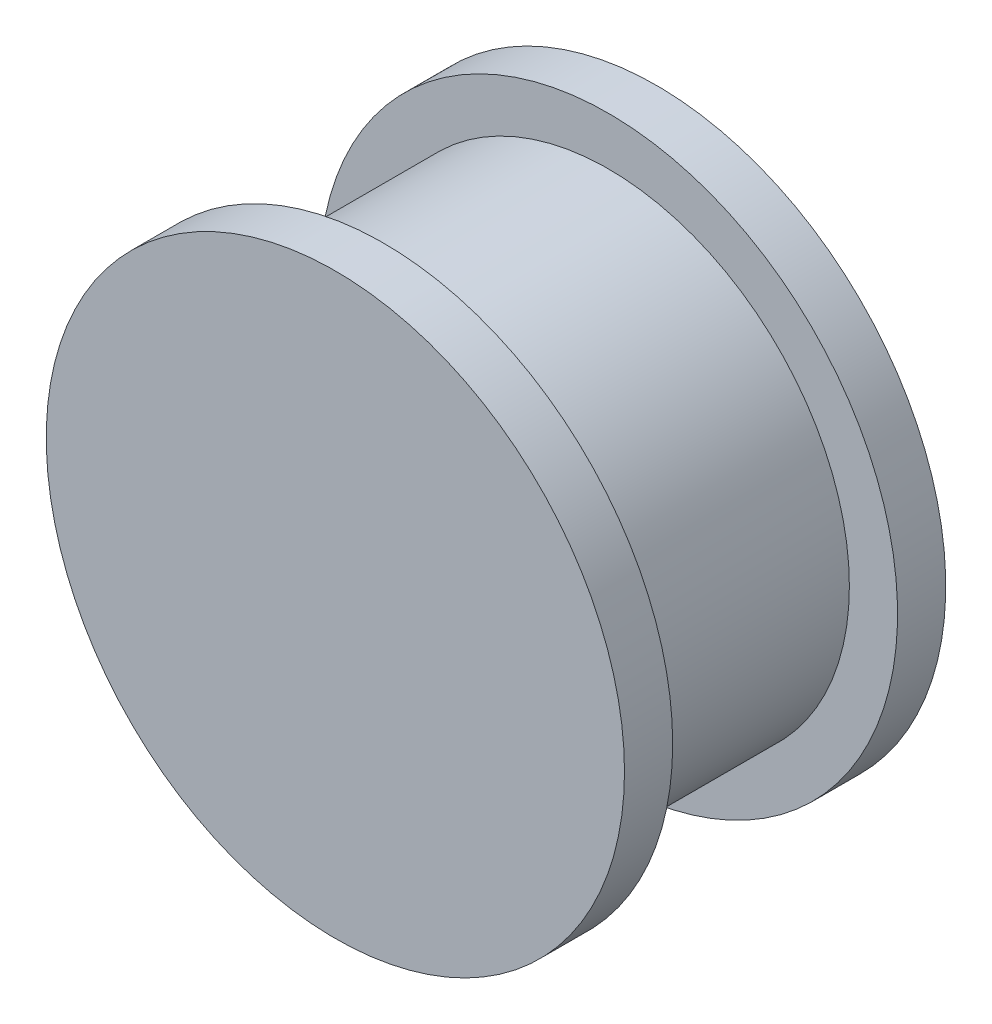
ISO-10303-21;
HEADER;
FILE_DESCRIPTION(('STEP AP214'),'2;1');
FILE_NAME('part.step','',(''),(''),'','','');
FILE_SCHEMA(('AUTOMOTIVE_DESIGN { 1 0 10303 214 1 1 1 1 }'));
ENDSEC;
DATA;
#1=APPLICATION_CONTEXT('core data for automotive mechanical design processes');
#2=APPLICATION_PROTOCOL_DEFINITION('international standard','automotive_design',2000,#1);
#3=PRODUCT_CONTEXT('',#1,'mechanical');
#4=PRODUCT('Part','Part','',(#3));
#5=PRODUCT_RELATED_PRODUCT_CATEGORY('part','',(#4));
#6=PRODUCT_DEFINITION_FORMATION('','',#4);
#7=PRODUCT_DEFINITION_CONTEXT('part definition',#1,'design');
#8=PRODUCT_DEFINITION('design','',#6,#7);
#9=PRODUCT_DEFINITION_SHAPE('','',#8);
#10=(LENGTH_UNIT() NAMED_UNIT(*) SI_UNIT(.MILLI.,.METRE.));
#11=(NAMED_UNIT(*) PLANE_ANGLE_UNIT() SI_UNIT($,.RADIAN.));
#12=(NAMED_UNIT(*) SI_UNIT($,.STERADIAN.) SOLID_ANGLE_UNIT());
#13=UNCERTAINTY_MEASURE_WITH_UNIT(LENGTH_MEASURE(1.E-05),#10,'distance_accuracy_value','');
#14=(GEOMETRIC_REPRESENTATION_CONTEXT(3) GLOBAL_UNCERTAINTY_ASSIGNED_CONTEXT((#13)) GLOBAL_UNIT_ASSIGNED_CONTEXT((#10,
#11,#12)) REPRESENTATION_CONTEXT('',''));
#15=CARTESIAN_POINT('',(0.,0.,0.));
#16=DIRECTION('',(0.,0.,1.));
#17=DIRECTION('',(1.,0.,0.));
#18=AXIS2_PLACEMENT_3D('',#15,#16,#17);
#19=CARTESIAN_POINT('',(0.,0.,-1.5));
#20=DIRECTION('',(0.,0.,-1.));
#21=DIRECTION('',(-1.,0.,0.));
#22=AXIS2_PLACEMENT_3D('',#19,#20,#21);
#23=PLANE('',#22);
#24=CARTESIAN_POINT('',(0.,0.,-1.5));
#25=DIRECTION('',(0.,0.,-1.));
#26=DIRECTION('',(-1.,0.,0.));
#27=AXIS2_PLACEMENT_3D('',#24,#25,#26);
#28=CIRCLE('',#27,9.);
#29=CARTESIAN_POINT('',(-9.,0.,-1.5));
#30=VERTEX_POINT('',#29);
#31=EDGE_CURVE('E11',#30,#30,#28,.T.);
#32=ORIENTED_EDGE('',*,*,#31,.T.);
#33=EDGE_LOOP('',(#32));
#34=FACE_BOUND('',#33,.T.);
#35=CARTESIAN_POINT('',(0.,0.,-1.5));
#36=DIRECTION('',(0.,0.,-1.));
#37=DIRECTION('',(-1.,0.,0.));
#38=AXIS2_PLACEMENT_3D('',#35,#36,#37);
#39=CIRCLE('',#38,6.5);
#40=CARTESIAN_POINT('',(-6.5,0.,-1.5));
#41=VERTEX_POINT('',#40);
#42=EDGE_CURVE('E49',#41,#41,#39,.T.);
#43=ORIENTED_EDGE('',*,*,#42,.F.);
#44=EDGE_LOOP('',(#43));
#45=FACE_BOUND('',#44,.T.);
#46=ADVANCED_FACE('F38',(#34,#45),#23,.T.);
#47=CARTESIAN_POINT('',(0.,0.,0.));
#48=DIRECTION('',(0.,0.,-1.));
#49=DIRECTION('',(-1.,0.,0.));
#50=AXIS2_PLACEMENT_3D('',#47,#48,#49);
#51=PLANE('',#50);
#52=CARTESIAN_POINT('',(0.,0.,0.));
#53=DIRECTION('',(0.,0.,-1.));
#54=DIRECTION('',(-1.,0.,0.));
#55=AXIS2_PLACEMENT_3D('',#52,#53,#54);
#56=CIRCLE('',#55,9.);
#57=CARTESIAN_POINT('',(-9.,0.,0.));
#58=VERTEX_POINT('',#57);
#59=EDGE_CURVE('E42',#58,#58,#56,.T.);
#60=ORIENTED_EDGE('',*,*,#59,.F.);
#61=EDGE_LOOP('',(#60));
#62=FACE_BOUND('',#61,.T.);
#63=CARTESIAN_POINT('',(0.,0.,0.));
#64=DIRECTION('',(0.,0.,-1.));
#65=DIRECTION('',(-1.,0.,0.));
#66=AXIS2_PLACEMENT_3D('',#63,#64,#65);
#67=CIRCLE('',#66,6.5);
#68=CARTESIAN_POINT('',(-6.5,0.,0.));
#69=VERTEX_POINT('',#68);
#70=EDGE_CURVE('E51',#69,#69,#67,.T.);
#71=ORIENTED_EDGE('',*,*,#70,.T.);
#72=EDGE_LOOP('',(#71));
#73=FACE_BOUND('',#72,.T.);
#74=ADVANCED_FACE('F61',(#62,#73),#51,.F.);
#75=CARTESIAN_POINT('',(0.,0.,-1.5));
#76=DIRECTION('',(0.,0.,1.));
#77=DIRECTION('',(1.,0.,0.));
#78=AXIS2_PLACEMENT_3D('',#75,#76,#77);
#79=CYLINDRICAL_SURFACE('',#78,9.);
#80=ORIENTED_EDGE('',*,*,#31,.F.);
#81=EDGE_LOOP('',(#80));
#82=FACE_BOUND('',#81,.T.);
#83=ORIENTED_EDGE('',*,*,#59,.T.);
#84=EDGE_LOOP('',(#83));
#85=FACE_BOUND('',#84,.T.);
#86=ADVANCED_FACE('F40',(#82,#85),#79,.T.);
#87=CARTESIAN_POINT('',(0.,0.,-1.5));
#88=DIRECTION('',(0.,0.,1.));
#89=DIRECTION('',(1.,0.,0.));
#90=AXIS2_PLACEMENT_3D('',#87,#88,#89);
#91=CYLINDRICAL_SURFACE('',#90,6.5);
#92=ORIENTED_EDGE('',*,*,#42,.T.);
#93=EDGE_LOOP('',(#92));
#94=FACE_BOUND('',#93,.T.);
#95=ORIENTED_EDGE('',*,*,#70,.F.);
#96=EDGE_LOOP('',(#95));
#97=FACE_BOUND('',#96,.T.);
#98=ADVANCED_FACE('F57',(#94,#97),#91,.F.);
#99=CLOSED_SHELL('',(#46,#74,#86,#98));
#100=MANIFOLD_SOLID_BREP('B2',#99);
#101=CARTESIAN_POINT('',(0.,0.,0.));
#102=DIRECTION('',(0.,0.,1.));
#103=DIRECTION('',(1.,0.,0.));
#104=AXIS2_PLACEMENT_3D('',#101,#102,#103);
#105=PLANE('',#104);
#106=CARTESIAN_POINT('',(0.,0.,0.));
#107=DIRECTION('',(0.,0.,1.));
#108=DIRECTION('',(1.,0.,0.));
#109=AXIS2_PLACEMENT_3D('',#106,#107,#108);
#110=CIRCLE('',#109,7.5);
#111=CARTESIAN_POINT('',(7.5,0.,0.));
#112=VERTEX_POINT('',#111);
#113=EDGE_CURVE('E111',#112,#112,#110,.T.);
#114=ORIENTED_EDGE('',*,*,#113,.F.);
#115=EDGE_LOOP('',(#114));
#116=FACE_BOUND('',#115,.T.);
#117=CARTESIAN_POINT('',(0.,0.,0.));
#118=DIRECTION('',(0.,0.,1.));
#119=DIRECTION('',(1.,0.,0.));
#120=AXIS2_PLACEMENT_3D('',#117,#118,#119);
#121=CIRCLE('',#120,6.5);
#122=CARTESIAN_POINT('',(6.5,0.,0.));
#123=VERTEX_POINT('',#122);
#124=EDGE_CURVE('E116',#123,#123,#121,.T.);
#125=ORIENTED_EDGE('',*,*,#124,.T.);
#126=EDGE_LOOP('',(#125));
#127=FACE_BOUND('',#126,.T.);
#128=ADVANCED_FACE('F100',(#116,#127),#105,.F.);
#129=CARTESIAN_POINT('',(0.,0.,7.));
#130=DIRECTION('',(0.,0.,-1.));
#131=DIRECTION('',(-1.,0.,0.));
#132=AXIS2_PLACEMENT_3D('',#129,#130,#131);
#133=CYLINDRICAL_SURFACE('',#132,7.5);
#134=CARTESIAN_POINT('',(0.,0.,7.));
#135=DIRECTION('',(0.,0.,1.));
#136=DIRECTION('',(1.,0.,0.));
#137=AXIS2_PLACEMENT_3D('',#134,#135,#136);
#138=CIRCLE('',#137,7.5);
#139=CARTESIAN_POINT('',(7.5,0.,7.));
#140=VERTEX_POINT('',#139);
#141=EDGE_CURVE('E107',#140,#140,#138,.T.);
#142=ORIENTED_EDGE('',*,*,#141,.F.);
#143=EDGE_LOOP('',(#142));
#144=FACE_BOUND('',#143,.T.);
#145=ORIENTED_EDGE('',*,*,#113,.T.);
#146=EDGE_LOOP('',(#145));
#147=FACE_BOUND('',#146,.T.);
#148=ADVANCED_FACE('F102',(#144,#147),#133,.T.);
#149=CARTESIAN_POINT('',(0.,0.,7.));
#150=DIRECTION('',(0.,0.,-1.));
#151=DIRECTION('',(-1.,0.,0.));
#152=AXIS2_PLACEMENT_3D('',#149,#150,#151);
#153=CYLINDRICAL_SURFACE('',#152,6.5);
#154=CARTESIAN_POINT('',(0.,0.,6.));
#155=DIRECTION('',(0.,0.,-1.));
#156=DIRECTION('',(-1.,0.,0.));
#157=AXIS2_PLACEMENT_3D('',#154,#155,#156);
#158=CIRCLE('',#157,6.5);
#159=CARTESIAN_POINT('',(-6.5,0.,6.));
#160=VERTEX_POINT('',#159);
#161=EDGE_CURVE('E37',#160,#160,#158,.T.);
#162=ORIENTED_EDGE('',*,*,#161,.F.);
#163=EDGE_LOOP('',(#162));
#164=FACE_BOUND('',#163,.T.);
#165=ORIENTED_EDGE('',*,*,#124,.F.);
#166=EDGE_LOOP('',(#165));
#167=FACE_BOUND('',#166,.T.);
#168=ADVANCED_FACE('F132',(#164,#167),#153,.F.);
#169=CARTESIAN_POINT('',(0.,0.,8.5));
#170=DIRECTION('',(0.,0.,-1.));
#171=DIRECTION('',(-1.,0.,0.));
#172=AXIS2_PLACEMENT_3D('',#169,#170,#171);
#173=CYLINDRICAL_SURFACE('',#172,9.);
#174=CARTESIAN_POINT('',(0.,0.,8.5));
#175=DIRECTION('',(0.,0.,1.));
#176=DIRECTION('',(1.,0.,0.));
#177=AXIS2_PLACEMENT_3D('',#174,#175,#176);
#178=CIRCLE('',#177,9.);
#179=CARTESIAN_POINT('',(9.,0.,8.5));
#180=VERTEX_POINT('',#179);
#181=EDGE_CURVE('E120',#180,#180,#178,.T.);
#182=ORIENTED_EDGE('',*,*,#181,.F.);
#183=EDGE_LOOP('',(#182));
#184=FACE_BOUND('',#183,.T.);
#185=CARTESIAN_POINT('',(0.,0.,7.));
#186=DIRECTION('',(0.,0.,1.));
#187=DIRECTION('',(1.,0.,0.));
#188=AXIS2_PLACEMENT_3D('',#185,#186,#187);
#189=CIRCLE('',#188,9.);
#190=CARTESIAN_POINT('',(9.,0.,7.));
#191=VERTEX_POINT('',#190);
#192=EDGE_CURVE('E121',#191,#191,#189,.T.);
#193=ORIENTED_EDGE('',*,*,#192,.T.);
#194=EDGE_LOOP('',(#193));
#195=FACE_BOUND('',#194,.T.);
#196=ADVANCED_FACE('F129',(#184,#195),#173,.T.);
#197=CARTESIAN_POINT('',(0.,0.,8.5));
#198=DIRECTION('',(0.,0.,1.));
#199=DIRECTION('',(1.,0.,0.));
#200=AXIS2_PLACEMENT_3D('',#197,#198,#199);
#201=PLANE('',#200);
#202=ORIENTED_EDGE('',*,*,#181,.T.);
#203=EDGE_LOOP('',(#202));
#204=FACE_BOUND('',#203,.T.);
#205=ADVANCED_FACE('F127',(#204),#201,.T.);
#206=CARTESIAN_POINT('',(0.,0.,7.));
#207=DIRECTION('',(0.,0.,1.));
#208=DIRECTION('',(1.,0.,0.));
#209=AXIS2_PLACEMENT_3D('',#206,#207,#208);
#210=PLANE('',#209);
#211=ORIENTED_EDGE('',*,*,#141,.T.);
#212=EDGE_LOOP('',(#211));
#213=FACE_BOUND('',#212,.T.);
#214=ORIENTED_EDGE('',*,*,#192,.F.);
#215=EDGE_LOOP('',(#214));
#216=FACE_BOUND('',#215,.T.);
#217=ADVANCED_FACE('F136',(#213,#216),#210,.F.);
#218=CARTESIAN_POINT('',(0.,0.,6.));
#219=DIRECTION('',(0.,0.,-1.));
#220=DIRECTION('',(-1.,0.,0.));
#221=AXIS2_PLACEMENT_3D('',#218,#219,#220);
#222=PLANE('',#221);
#223=ORIENTED_EDGE('',*,*,#161,.T.);
#224=EDGE_LOOP('',(#223));
#225=FACE_BOUND('',#224,.T.);
#226=ADVANCED_FACE('F138',(#225),#222,.T.);
#227=CLOSED_SHELL('',(#128,#148,#168,#196,#205,#217,#226));
#228=MANIFOLD_SOLID_BREP('B6',#227);
#229=ADVANCED_BREP_SHAPE_REPRESENTATION('',(#18,#100,#228),#14);
#230=SHAPE_DEFINITION_REPRESENTATION(#9,#229);
ENDSEC;
END-ISO-10303-21;
